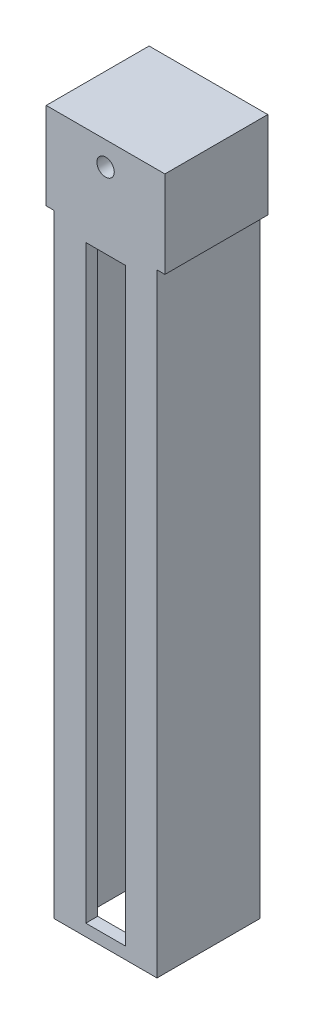
ISO-10303-21;
HEADER;
FILE_DESCRIPTION(('STEP AP214'),'2;1');
FILE_NAME('part.step','',(''),(''),'','','');
FILE_SCHEMA(('AUTOMOTIVE_DESIGN { 1 0 10303 214 1 1 1 1 }'));
ENDSEC;
DATA;
#1=APPLICATION_CONTEXT('core data for automotive mechanical design processes');
#2=APPLICATION_PROTOCOL_DEFINITION('international standard','automotive_design',2000,#1);
#3=PRODUCT_CONTEXT('',#1,'mechanical');
#4=PRODUCT('Part','Part','',(#3));
#5=PRODUCT_RELATED_PRODUCT_CATEGORY('part','',(#4));
#6=PRODUCT_DEFINITION_FORMATION('','',#4);
#7=PRODUCT_DEFINITION_CONTEXT('part definition',#1,'design');
#8=PRODUCT_DEFINITION('design','',#6,#7);
#9=PRODUCT_DEFINITION_SHAPE('','',#8);
#10=(LENGTH_UNIT() NAMED_UNIT(*) SI_UNIT(.MILLI.,.METRE.));
#11=(NAMED_UNIT(*) PLANE_ANGLE_UNIT() SI_UNIT($,.RADIAN.));
#12=(NAMED_UNIT(*) SI_UNIT($,.STERADIAN.) SOLID_ANGLE_UNIT());
#13=UNCERTAINTY_MEASURE_WITH_UNIT(LENGTH_MEASURE(1.E-05),#10,'distance_accuracy_value','');
#14=(GEOMETRIC_REPRESENTATION_CONTEXT(3) GLOBAL_UNCERTAINTY_ASSIGNED_CONTEXT((#13)) GLOBAL_UNIT_ASSIGNED_CONTEXT((#10,
#11,#12)) REPRESENTATION_CONTEXT('',''));
#15=CARTESIAN_POINT('',(0.,0.,0.));
#16=DIRECTION('',(0.,0.,1.));
#17=DIRECTION('',(1.,0.,0.));
#18=AXIS2_PLACEMENT_3D('',#15,#16,#17);
#19=CARTESIAN_POINT('',(0.,0.,0.));
#20=DIRECTION('',(0.,-1.,0.));
#21=DIRECTION('',(0.,0.,-1.));
#22=AXIS2_PLACEMENT_3D('',#19,#20,#21);
#23=PLANE('',#22);
#24=DIRECTION('',(0.,0.,-1.));
#25=VECTOR('',#24,1.);
#26=CARTESIAN_POINT('',(13.,0.,13.));
#27=LINE('',#26,#25);
#28=CARTESIAN_POINT('',(13.,0.,13.));
#29=VERTEX_POINT('',#28);
#30=CARTESIAN_POINT('',(13.,0.,-13.));
#31=VERTEX_POINT('',#30);
#32=EDGE_CURVE('E215',#29,#31,#27,.T.);
#33=ORIENTED_EDGE('',*,*,#32,.F.);
#34=DIRECTION('',(1.,0.,0.));
#35=VECTOR('',#34,1.);
#36=CARTESIAN_POINT('',(-13.,0.,13.));
#37=LINE('',#36,#35);
#38=CARTESIAN_POINT('',(-13.,0.,13.));
#39=VERTEX_POINT('',#38);
#40=EDGE_CURVE('E250',#39,#29,#37,.T.);
#41=ORIENTED_EDGE('',*,*,#40,.F.);
#42=DIRECTION('',(0.,0.,1.));
#43=VECTOR('',#42,1.);
#44=CARTESIAN_POINT('',(-13.,0.,13.));
#45=LINE('',#44,#43);
#46=CARTESIAN_POINT('',(-13.,0.,-13.));
#47=VERTEX_POINT('',#46);
#48=EDGE_CURVE('E258',#47,#39,#45,.T.);
#49=ORIENTED_EDGE('',*,*,#48,.F.);
#50=DIRECTION('',(-1.,0.,0.));
#51=VECTOR('',#50,1.);
#52=CARTESIAN_POINT('',(-13.,0.,-13.));
#53=LINE('',#52,#51);
#54=EDGE_CURVE('E256',#31,#47,#53,.T.);
#55=ORIENTED_EDGE('',*,*,#54,.F.);
#56=EDGE_LOOP('',(#33,#41,#49,#55));
#57=FACE_BOUND('',#56,.T.);
#58=DIRECTION('',(1.,0.,0.));
#59=VECTOR('',#58,1.);
#60=CARTESIAN_POINT('',(0.,0.,10.));
#61=LINE('',#60,#59);
#62=CARTESIAN_POINT('',(-10.,0.,10.));
#63=VERTEX_POINT('',#62);
#64=CARTESIAN_POINT('',(10.,0.,10.));
#65=VERTEX_POINT('',#64);
#66=EDGE_CURVE('E227',#63,#65,#61,.T.);
#67=ORIENTED_EDGE('',*,*,#66,.T.);
#68=DIRECTION('',(0.,0.,-1.));
#69=VECTOR('',#68,1.);
#70=CARTESIAN_POINT('',(10.,0.,0.));
#71=LINE('',#70,#69);
#72=CARTESIAN_POINT('',(10.,0.,-10.));
#73=VERTEX_POINT('',#72);
#74=EDGE_CURVE('E206',#65,#73,#71,.T.);
#75=ORIENTED_EDGE('',*,*,#74,.T.);
#76=DIRECTION('',(-1.,0.,0.));
#77=VECTOR('',#76,1.);
#78=CARTESIAN_POINT('',(0.,0.,-10.));
#79=LINE('',#78,#77);
#80=CARTESIAN_POINT('',(-10.,0.,-10.));
#81=VERTEX_POINT('',#80);
#82=EDGE_CURVE('E226',#73,#81,#79,.T.);
#83=ORIENTED_EDGE('',*,*,#82,.T.);
#84=DIRECTION('',(0.,0.,1.));
#85=VECTOR('',#84,1.);
#86=CARTESIAN_POINT('',(-10.,0.,0.));
#87=LINE('',#86,#85);
#88=EDGE_CURVE('E231',#81,#63,#87,.T.);
#89=ORIENTED_EDGE('',*,*,#88,.T.);
#90=EDGE_LOOP('',(#67,#75,#83,#89));
#91=FACE_BOUND('',#90,.T.);
#92=ADVANCED_FACE('F39',(#57,#91),#23,.T.);
#93=CARTESIAN_POINT('',(13.,155.,13.));
#94=DIRECTION('',(-1.,0.,0.));
#95=DIRECTION('',(0.,0.,1.));
#96=AXIS2_PLACEMENT_3D('',#93,#94,#95);
#97=PLANE('',#96);
#98=ORIENTED_EDGE('',*,*,#32,.T.);
#99=DIRECTION('',(0.,-1.,0.));
#100=VECTOR('',#99,1.);
#101=CARTESIAN_POINT('',(13.,155.,-13.));
#102=LINE('',#101,#100);
#103=CARTESIAN_POINT('',(13.,155.,-13.));
#104=VERTEX_POINT('',#103);
#105=EDGE_CURVE('E11',#104,#31,#102,.T.);
#106=ORIENTED_EDGE('',*,*,#105,.F.);
#107=DIRECTION('',(0.,0.,-1.));
#108=VECTOR('',#107,1.);
#109=CARTESIAN_POINT('',(13.,155.,13.));
#110=LINE('',#109,#108);
#111=CARTESIAN_POINT('',(13.,155.,13.));
#112=VERTEX_POINT('',#111);
#113=EDGE_CURVE('E246',#112,#104,#110,.T.);
#114=ORIENTED_EDGE('',*,*,#113,.F.);
#115=DIRECTION('',(0.,-1.,0.));
#116=VECTOR('',#115,1.);
#117=CARTESIAN_POINT('',(13.,155.,13.));
#118=LINE('',#117,#116);
#119=EDGE_CURVE('E253',#112,#29,#118,.T.);
#120=ORIENTED_EDGE('',*,*,#119,.T.);
#121=EDGE_LOOP('',(#98,#106,#114,#120));
#122=FACE_BOUND('',#121,.T.);
#123=ADVANCED_FACE('F41',(#122),#97,.F.);
#124=CARTESIAN_POINT('',(-13.,155.,-13.));
#125=DIRECTION('',(0.,0.,1.));
#126=DIRECTION('',(1.,0.,0.));
#127=AXIS2_PLACEMENT_3D('',#124,#125,#126);
#128=PLANE('',#127);
#129=CARTESIAN_POINT('',(0.,171.,-13.));
#130=DIRECTION('',(0.,0.,1.));
#131=DIRECTION('',(1.,0.,0.));
#132=AXIS2_PLACEMENT_3D('',#129,#130,#131);
#133=CIRCLE('',#132,2.2);
#134=CARTESIAN_POINT('',(2.2,171.,-13.));
#135=VERTEX_POINT('',#134);
#136=EDGE_CURVE('E299',#135,#135,#133,.T.);
#137=ORIENTED_EDGE('',*,*,#136,.T.);
#138=EDGE_LOOP('',(#137));
#139=FACE_BOUND('',#138,.T.);
#140=ORIENTED_EDGE('',*,*,#54,.T.);
#141=DIRECTION('',(0.,-1.,0.));
#142=VECTOR('',#141,1.);
#143=CARTESIAN_POINT('',(-13.,155.,-13.));
#144=LINE('',#143,#142);
#145=CARTESIAN_POINT('',(-13.,155.,-13.));
#146=VERTEX_POINT('',#145);
#147=EDGE_CURVE('E47',#146,#47,#144,.T.);
#148=ORIENTED_EDGE('',*,*,#147,.F.);
#149=DIRECTION('',(-1.,0.,0.));
#150=VECTOR('',#149,1.);
#151=CARTESIAN_POINT('',(-15.,155.,-13.));
#152=LINE('',#151,#150);
#153=CARTESIAN_POINT('',(-15.,155.,-13.));
#154=VERTEX_POINT('',#153);
#155=EDGE_CURVE('E298',#146,#154,#152,.T.);
#156=ORIENTED_EDGE('',*,*,#155,.T.);
#157=DIRECTION('',(0.,-1.,0.));
#158=VECTOR('',#157,1.);
#159=CARTESIAN_POINT('',(-15.,177.,-13.));
#160=LINE('',#159,#158);
#161=CARTESIAN_POINT('',(-15.,177.,-13.));
#162=VERTEX_POINT('',#161);
#163=EDGE_CURVE('E160',#162,#154,#160,.T.);
#164=ORIENTED_EDGE('',*,*,#163,.F.);
#165=DIRECTION('',(-1.,0.,0.));
#166=VECTOR('',#165,1.);
#167=CARTESIAN_POINT('',(-15.,177.,-13.));
#168=LINE('',#167,#166);
#169=CARTESIAN_POINT('',(15.,177.,-13.));
#170=VERTEX_POINT('',#169);
#171=EDGE_CURVE('E152',#170,#162,#168,.T.);
#172=ORIENTED_EDGE('',*,*,#171,.F.);
#173=DIRECTION('',(0.,-1.,0.));
#174=VECTOR('',#173,1.);
#175=CARTESIAN_POINT('',(15.,177.,-13.));
#176=LINE('',#175,#174);
#177=CARTESIAN_POINT('',(15.,155.,-13.));
#178=VERTEX_POINT('',#177);
#179=EDGE_CURVE('E157',#170,#178,#176,.T.);
#180=ORIENTED_EDGE('',*,*,#179,.T.);
#181=EDGE_CURVE('E286',#178,#104,#152,.T.);
#182=ORIENTED_EDGE('',*,*,#181,.T.);
#183=ORIENTED_EDGE('',*,*,#105,.T.);
#184=EDGE_LOOP('',(#140,#148,#156,#164,#172,#180,#182,#183));
#185=FACE_BOUND('',#184,.T.);
#186=ADVANCED_FACE('F154',(#139,#185),#128,.F.);
#187=CARTESIAN_POINT('',(-13.,155.,13.));
#188=DIRECTION('',(1.,0.,0.));
#189=DIRECTION('',(0.,0.,-1.));
#190=AXIS2_PLACEMENT_3D('',#187,#188,#189);
#191=PLANE('',#190);
#192=ORIENTED_EDGE('',*,*,#48,.T.);
#193=DIRECTION('',(0.,-1.,0.));
#194=VECTOR('',#193,1.);
#195=CARTESIAN_POINT('',(-13.,155.,13.));
#196=LINE('',#195,#194);
#197=CARTESIAN_POINT('',(-13.,155.,13.));
#198=VERTEX_POINT('',#197);
#199=EDGE_CURVE('E263',#198,#39,#196,.T.);
#200=ORIENTED_EDGE('',*,*,#199,.F.);
#201=DIRECTION('',(0.,0.,1.));
#202=VECTOR('',#201,1.);
#203=CARTESIAN_POINT('',(-13.,155.,13.));
#204=LINE('',#203,#202);
#205=EDGE_CURVE('E249',#146,#198,#204,.T.);
#206=ORIENTED_EDGE('',*,*,#205,.F.);
#207=ORIENTED_EDGE('',*,*,#147,.T.);
#208=EDGE_LOOP('',(#192,#200,#206,#207));
#209=FACE_BOUND('',#208,.T.);
#210=ADVANCED_FACE('F269',(#209),#191,.F.);
#211=CARTESIAN_POINT('',(-13.,155.,13.));
#212=DIRECTION('',(0.,0.,-1.));
#213=DIRECTION('',(-1.,0.,0.));
#214=AXIS2_PLACEMENT_3D('',#211,#212,#213);
#215=PLANE('',#214);
#216=CARTESIAN_POINT('',(0.,171.,13.));
#217=DIRECTION('',(0.,0.,1.));
#218=DIRECTION('',(1.,0.,0.));
#219=AXIS2_PLACEMENT_3D('',#216,#217,#218);
#220=CIRCLE('',#219,2.2);
#221=CARTESIAN_POINT('',(2.2,171.,13.));
#222=VERTEX_POINT('',#221);
#223=EDGE_CURVE('E304',#222,#222,#220,.T.);
#224=ORIENTED_EDGE('',*,*,#223,.F.);
#225=EDGE_LOOP('',(#224));
#226=FACE_BOUND('',#225,.T.);
#227=DIRECTION('',(1.,0.,0.));
#228=VECTOR('',#227,1.);
#229=CARTESIAN_POINT('',(5.,3.,13.));
#230=LINE('',#229,#228);
#231=CARTESIAN_POINT('',(-5.,3.,13.));
#232=VERTEX_POINT('',#231);
#233=CARTESIAN_POINT('',(5.,3.,13.));
#234=VERTEX_POINT('',#233);
#235=EDGE_CURVE('E179',#232,#234,#230,.T.);
#236=ORIENTED_EDGE('',*,*,#235,.F.);
#237=DIRECTION('',(0.,-1.,0.));
#238=VECTOR('',#237,1.);
#239=CARTESIAN_POINT('',(-5.,3.,13.));
#240=LINE('',#239,#238);
#241=CARTESIAN_POINT('',(-5.,152.,13.));
#242=VERTEX_POINT('',#241);
#243=EDGE_CURVE('E54',#242,#232,#240,.T.);
#244=ORIENTED_EDGE('',*,*,#243,.F.);
#245=DIRECTION('',(-1.,0.,0.));
#246=VECTOR('',#245,1.);
#247=CARTESIAN_POINT('',(5.,152.,13.));
#248=LINE('',#247,#246);
#249=CARTESIAN_POINT('',(5.,152.,13.));
#250=VERTEX_POINT('',#249);
#251=EDGE_CURVE('E189',#250,#242,#248,.T.);
#252=ORIENTED_EDGE('',*,*,#251,.F.);
#253=DIRECTION('',(0.,1.,0.));
#254=VECTOR('',#253,1.);
#255=CARTESIAN_POINT('',(5.,3.,13.));
#256=LINE('',#255,#254);
#257=EDGE_CURVE('E199',#234,#250,#256,.T.);
#258=ORIENTED_EDGE('',*,*,#257,.F.);
#259=EDGE_LOOP('',(#236,#244,#252,#258));
#260=FACE_BOUND('',#259,.T.);
#261=ORIENTED_EDGE('',*,*,#40,.T.);
#262=ORIENTED_EDGE('',*,*,#119,.F.);
#263=DIRECTION('',(1.,0.,0.));
#264=VECTOR('',#263,1.);
#265=CARTESIAN_POINT('',(-15.,155.,13.));
#266=LINE('',#265,#264);
#267=CARTESIAN_POINT('',(15.,155.,13.));
#268=VERTEX_POINT('',#267);
#269=EDGE_CURVE('E282',#112,#268,#266,.T.);
#270=ORIENTED_EDGE('',*,*,#269,.T.);
#271=DIRECTION('',(0.,-1.,0.));
#272=VECTOR('',#271,1.);
#273=CARTESIAN_POINT('',(15.,177.,13.));
#274=LINE('',#273,#272);
#275=CARTESIAN_POINT('',(15.,177.,13.));
#276=VERTEX_POINT('',#275);
#277=EDGE_CURVE('E290',#276,#268,#274,.T.);
#278=ORIENTED_EDGE('',*,*,#277,.F.);
#279=DIRECTION('',(1.,0.,0.));
#280=VECTOR('',#279,1.);
#281=CARTESIAN_POINT('',(-15.,177.,13.));
#282=LINE('',#281,#280);
#283=CARTESIAN_POINT('',(-15.,177.,13.));
#284=VERTEX_POINT('',#283);
#285=EDGE_CURVE('E169',#284,#276,#282,.T.);
#286=ORIENTED_EDGE('',*,*,#285,.F.);
#287=DIRECTION('',(0.,-1.,0.));
#288=VECTOR('',#287,1.);
#289=CARTESIAN_POINT('',(-15.,177.,13.));
#290=LINE('',#289,#288);
#291=CARTESIAN_POINT('',(-15.,155.,13.));
#292=VERTEX_POINT('',#291);
#293=EDGE_CURVE('E181',#284,#292,#290,.T.);
#294=ORIENTED_EDGE('',*,*,#293,.T.);
#295=EDGE_CURVE('E173',#292,#198,#266,.T.);
#296=ORIENTED_EDGE('',*,*,#295,.T.);
#297=ORIENTED_EDGE('',*,*,#199,.T.);
#298=EDGE_LOOP('',(#261,#262,#270,#278,#286,#294,#296,#297));
#299=FACE_BOUND('',#298,.T.);
#300=ADVANCED_FACE('F276',(#226,#260,#299),#215,.F.);
#301=CARTESIAN_POINT('',(10.,155.,13.));
#302=DIRECTION('',(-1.,0.,0.));
#303=DIRECTION('',(0.,0.,1.));
#304=AXIS2_PLACEMENT_3D('',#301,#302,#303);
#305=PLANE('',#304);
#306=ORIENTED_EDGE('',*,*,#74,.F.);
#307=DIRECTION('',(0.,-1.,0.));
#308=VECTOR('',#307,1.);
#309=CARTESIAN_POINT('',(10.,155.,10.));
#310=LINE('',#309,#308);
#311=CARTESIAN_POINT('',(10.,155.,10.));
#312=VERTEX_POINT('',#311);
#313=EDGE_CURVE('E217',#312,#65,#310,.T.);
#314=ORIENTED_EDGE('',*,*,#313,.F.);
#315=DIRECTION('',(0.,0.,-1.));
#316=VECTOR('',#315,1.);
#317=CARTESIAN_POINT('',(10.,155.,0.));
#318=LINE('',#317,#316);
#319=CARTESIAN_POINT('',(10.,155.,-10.));
#320=VERTEX_POINT('',#319);
#321=EDGE_CURVE('E230',#312,#320,#318,.T.);
#322=ORIENTED_EDGE('',*,*,#321,.T.);
#323=DIRECTION('',(0.,-1.,0.));
#324=VECTOR('',#323,1.);
#325=CARTESIAN_POINT('',(10.,155.,-10.));
#326=LINE('',#325,#324);
#327=EDGE_CURVE('E212',#320,#73,#326,.T.);
#328=ORIENTED_EDGE('',*,*,#327,.T.);
#329=EDGE_LOOP('',(#306,#314,#322,#328));
#330=FACE_BOUND('',#329,.T.);
#331=ADVANCED_FACE('F319',(#330),#305,.T.);
#332=CARTESIAN_POINT('',(-13.,155.,-10.));
#333=DIRECTION('',(0.,0.,1.));
#334=DIRECTION('',(1.,0.,0.));
#335=AXIS2_PLACEMENT_3D('',#332,#333,#334);
#336=PLANE('',#335);
#337=ORIENTED_EDGE('',*,*,#82,.F.);
#338=ORIENTED_EDGE('',*,*,#327,.F.);
#339=DIRECTION('',(-1.,0.,0.));
#340=VECTOR('',#339,1.);
#341=CARTESIAN_POINT('',(0.,155.,-10.));
#342=LINE('',#341,#340);
#343=CARTESIAN_POINT('',(-10.,155.,-10.));
#344=VERTEX_POINT('',#343);
#345=EDGE_CURVE('E238',#320,#344,#342,.T.);
#346=ORIENTED_EDGE('',*,*,#345,.T.);
#347=DIRECTION('',(0.,-1.,0.));
#348=VECTOR('',#347,1.);
#349=CARTESIAN_POINT('',(-10.,155.,-10.));
#350=LINE('',#349,#348);
#351=EDGE_CURVE('E216',#344,#81,#350,.T.);
#352=ORIENTED_EDGE('',*,*,#351,.T.);
#353=EDGE_LOOP('',(#337,#338,#346,#352));
#354=FACE_BOUND('',#353,.T.);
#355=ADVANCED_FACE('F434',(#354),#336,.T.);
#356=CARTESIAN_POINT('',(-10.,155.,13.));
#357=DIRECTION('',(1.,0.,0.));
#358=DIRECTION('',(0.,0.,-1.));
#359=AXIS2_PLACEMENT_3D('',#356,#357,#358);
#360=PLANE('',#359);
#361=ORIENTED_EDGE('',*,*,#88,.F.);
#362=ORIENTED_EDGE('',*,*,#351,.F.);
#363=DIRECTION('',(0.,0.,1.));
#364=VECTOR('',#363,1.);
#365=CARTESIAN_POINT('',(-10.,155.,0.));
#366=LINE('',#365,#364);
#367=CARTESIAN_POINT('',(-10.,155.,10.));
#368=VERTEX_POINT('',#367);
#369=EDGE_CURVE('E241',#344,#368,#366,.T.);
#370=ORIENTED_EDGE('',*,*,#369,.T.);
#371=DIRECTION('',(0.,-1.,0.));
#372=VECTOR('',#371,1.);
#373=CARTESIAN_POINT('',(-10.,155.,10.));
#374=LINE('',#373,#372);
#375=EDGE_CURVE('E219',#368,#63,#374,.T.);
#376=ORIENTED_EDGE('',*,*,#375,.T.);
#377=EDGE_LOOP('',(#361,#362,#370,#376));
#378=FACE_BOUND('',#377,.T.);
#379=ADVANCED_FACE('F426',(#378),#360,.T.);
#380=CARTESIAN_POINT('',(-13.,155.,10.));
#381=DIRECTION('',(0.,0.,-1.));
#382=DIRECTION('',(-1.,0.,0.));
#383=AXIS2_PLACEMENT_3D('',#380,#381,#382);
#384=PLANE('',#383);
#385=DIRECTION('',(0.,-1.,0.));
#386=VECTOR('',#385,1.);
#387=CARTESIAN_POINT('',(-5.,3.,10.));
#388=LINE('',#387,#386);
#389=CARTESIAN_POINT('',(-5.,152.,10.));
#390=VERTEX_POINT('',#389);
#391=CARTESIAN_POINT('',(-5.,3.,10.));
#392=VERTEX_POINT('',#391);
#393=EDGE_CURVE('E185',#390,#392,#388,.T.);
#394=ORIENTED_EDGE('',*,*,#393,.T.);
#395=DIRECTION('',(1.,0.,0.));
#396=VECTOR('',#395,1.);
#397=CARTESIAN_POINT('',(5.,3.,10.));
#398=LINE('',#397,#396);
#399=CARTESIAN_POINT('',(4.99999999999999,3.,10.));
#400=VERTEX_POINT('',#399);
#401=EDGE_CURVE('E188',#392,#400,#398,.T.);
#402=ORIENTED_EDGE('',*,*,#401,.T.);
#403=DIRECTION('',(0.,1.,0.));
#404=VECTOR('',#403,1.);
#405=CARTESIAN_POINT('',(5.,3.,10.));
#406=LINE('',#405,#404);
#407=CARTESIAN_POINT('',(5.,152.,10.));
#408=VERTEX_POINT('',#407);
#409=EDGE_CURVE('E62',#400,#408,#406,.T.);
#410=ORIENTED_EDGE('',*,*,#409,.T.);
#411=DIRECTION('',(-1.,0.,0.));
#412=VECTOR('',#411,1.);
#413=CARTESIAN_POINT('',(5.,152.,10.));
#414=LINE('',#413,#412);
#415=EDGE_CURVE('E193',#408,#390,#414,.T.);
#416=ORIENTED_EDGE('',*,*,#415,.T.);
#417=EDGE_LOOP('',(#394,#402,#410,#416));
#418=FACE_BOUND('',#417,.T.);
#419=ORIENTED_EDGE('',*,*,#66,.F.);
#420=ORIENTED_EDGE('',*,*,#375,.F.);
#421=DIRECTION('',(1.,0.,0.));
#422=VECTOR('',#421,1.);
#423=CARTESIAN_POINT('',(0.,155.,10.));
#424=LINE('',#423,#422);
#425=EDGE_CURVE('E220',#368,#312,#424,.T.);
#426=ORIENTED_EDGE('',*,*,#425,.T.);
#427=ORIENTED_EDGE('',*,*,#313,.T.);
#428=EDGE_LOOP('',(#419,#420,#426,#427));
#429=FACE_BOUND('',#428,.T.);
#430=ADVANCED_FACE('F331',(#418,#429),#384,.T.);
#431=CARTESIAN_POINT('',(-5.,3.,10.));
#432=DIRECTION('',(-1.,0.,0.));
#433=DIRECTION('',(0.,0.,1.));
#434=AXIS2_PLACEMENT_3D('',#431,#432,#433);
#435=PLANE('',#434);
#436=ORIENTED_EDGE('',*,*,#243,.T.);
#437=DIRECTION('',(0.,0.,1.));
#438=VECTOR('',#437,1.);
#439=CARTESIAN_POINT('',(-5.,3.,10.));
#440=LINE('',#439,#438);
#441=EDGE_CURVE('E195',#392,#232,#440,.T.);
#442=ORIENTED_EDGE('',*,*,#441,.F.);
#443=ORIENTED_EDGE('',*,*,#393,.F.);
#444=DIRECTION('',(0.,0.,1.));
#445=VECTOR('',#444,1.);
#446=CARTESIAN_POINT('',(-5.,152.,10.));
#447=LINE('',#446,#445);
#448=EDGE_CURVE('E204',#390,#242,#447,.T.);
#449=ORIENTED_EDGE('',*,*,#448,.T.);
#450=EDGE_LOOP('',(#436,#442,#443,#449));
#451=FACE_BOUND('',#450,.T.);
#452=ADVANCED_FACE('F328',(#451),#435,.F.);
#453=CARTESIAN_POINT('',(5.,152.,10.));
#454=DIRECTION('',(0.,1.,0.));
#455=DIRECTION('',(0.,0.,1.));
#456=AXIS2_PLACEMENT_3D('',#453,#454,#455);
#457=PLANE('',#456);
#458=ORIENTED_EDGE('',*,*,#251,.T.);
#459=ORIENTED_EDGE('',*,*,#448,.F.);
#460=ORIENTED_EDGE('',*,*,#415,.F.);
#461=DIRECTION('',(0.,0.,1.));
#462=VECTOR('',#461,1.);
#463=CARTESIAN_POINT('',(5.,152.,10.));
#464=LINE('',#463,#462);
#465=EDGE_CURVE('E207',#408,#250,#464,.T.);
#466=ORIENTED_EDGE('',*,*,#465,.T.);
#467=EDGE_LOOP('',(#458,#459,#460,#466));
#468=FACE_BOUND('',#467,.T.);
#469=ADVANCED_FACE('F334',(#468),#457,.F.);
#470=CARTESIAN_POINT('',(5.,3.,10.));
#471=DIRECTION('',(1.,0.,0.));
#472=DIRECTION('',(0.,0.,-1.));
#473=AXIS2_PLACEMENT_3D('',#470,#471,#472);
#474=PLANE('',#473);
#475=ORIENTED_EDGE('',*,*,#257,.T.);
#476=ORIENTED_EDGE('',*,*,#465,.F.);
#477=ORIENTED_EDGE('',*,*,#409,.F.);
#478=DIRECTION('',(0.,0.,1.));
#479=VECTOR('',#478,1.);
#480=CARTESIAN_POINT('',(5.,3.,10.));
#481=LINE('',#480,#479);
#482=EDGE_CURVE('E209',#400,#234,#481,.T.);
#483=ORIENTED_EDGE('',*,*,#482,.T.);
#484=EDGE_LOOP('',(#475,#476,#477,#483));
#485=FACE_BOUND('',#484,.T.);
#486=ADVANCED_FACE('F335',(#485),#474,.F.);
#487=CARTESIAN_POINT('',(5.,3.,10.));
#488=DIRECTION('',(0.,-1.,0.));
#489=DIRECTION('',(0.,0.,-1.));
#490=AXIS2_PLACEMENT_3D('',#487,#488,#489);
#491=PLANE('',#490);
#492=ORIENTED_EDGE('',*,*,#235,.T.);
#493=ORIENTED_EDGE('',*,*,#482,.F.);
#494=ORIENTED_EDGE('',*,*,#401,.F.);
#495=ORIENTED_EDGE('',*,*,#441,.T.);
#496=EDGE_LOOP('',(#492,#493,#494,#495));
#497=FACE_BOUND('',#496,.T.);
#498=ADVANCED_FACE('F325',(#497),#491,.F.);
#499=CARTESIAN_POINT('',(0.,155.,0.));
#500=DIRECTION('',(0.,-1.,0.));
#501=DIRECTION('',(0.,0.,-1.));
#502=AXIS2_PLACEMENT_3D('',#499,#500,#501);
#503=PLANE('',#502);
#504=ORIENTED_EDGE('',*,*,#321,.F.);
#505=ORIENTED_EDGE('',*,*,#425,.F.);
#506=ORIENTED_EDGE('',*,*,#369,.F.);
#507=ORIENTED_EDGE('',*,*,#345,.F.);
#508=EDGE_LOOP('',(#504,#505,#506,#507));
#509=FACE_BOUND('',#508,.T.);
#510=ADVANCED_FACE('F342',(#509),#503,.T.);
#511=ORIENTED_EDGE('',*,*,#269,.F.);
#512=ORIENTED_EDGE('',*,*,#113,.T.);
#513=ORIENTED_EDGE('',*,*,#181,.F.);
#514=DIRECTION('',(0.,0.,-1.));
#515=VECTOR('',#514,1.);
#516=CARTESIAN_POINT('',(15.,155.,13.));
#517=LINE('',#516,#515);
#518=EDGE_CURVE('E177',#268,#178,#517,.T.);
#519=ORIENTED_EDGE('',*,*,#518,.F.);
#520=EDGE_LOOP('',(#511,#512,#513,#519));
#521=FACE_BOUND('',#520,.T.);
#522=ADVANCED_FACE('F283',(#521),#503,.T.);
#523=CARTESIAN_POINT('',(15.,177.,13.));
#524=DIRECTION('',(-1.,0.,0.));
#525=DIRECTION('',(0.,0.,1.));
#526=AXIS2_PLACEMENT_3D('',#523,#524,#525);
#527=PLANE('',#526);
#528=ORIENTED_EDGE('',*,*,#518,.T.);
#529=ORIENTED_EDGE('',*,*,#179,.F.);
#530=DIRECTION('',(0.,0.,-1.));
#531=VECTOR('',#530,1.);
#532=CARTESIAN_POINT('',(15.,177.,13.));
#533=LINE('',#532,#531);
#534=EDGE_CURVE('E164',#276,#170,#533,.T.);
#535=ORIENTED_EDGE('',*,*,#534,.F.);
#536=ORIENTED_EDGE('',*,*,#277,.T.);
#537=EDGE_LOOP('',(#528,#529,#535,#536));
#538=FACE_BOUND('',#537,.T.);
#539=ADVANCED_FACE('F175',(#538),#527,.F.);
#540=CARTESIAN_POINT('',(-15.,177.,13.));
#541=DIRECTION('',(1.,0.,0.));
#542=DIRECTION('',(0.,0.,-1.));
#543=AXIS2_PLACEMENT_3D('',#540,#541,#542);
#544=PLANE('',#543);
#545=DIRECTION('',(0.,0.,1.));
#546=VECTOR('',#545,1.);
#547=CARTESIAN_POINT('',(-15.,155.,13.));
#548=LINE('',#547,#546);
#549=EDGE_CURVE('E284',#154,#292,#548,.T.);
#550=ORIENTED_EDGE('',*,*,#549,.T.);
#551=ORIENTED_EDGE('',*,*,#293,.F.);
#552=DIRECTION('',(0.,0.,1.));
#553=VECTOR('',#552,1.);
#554=CARTESIAN_POINT('',(-15.,177.,13.));
#555=LINE('',#554,#553);
#556=EDGE_CURVE('E163',#162,#284,#555,.T.);
#557=ORIENTED_EDGE('',*,*,#556,.F.);
#558=ORIENTED_EDGE('',*,*,#163,.T.);
#559=EDGE_LOOP('',(#550,#551,#557,#558));
#560=FACE_BOUND('',#559,.T.);
#561=ADVANCED_FACE('F388',(#560),#544,.F.);
#562=CARTESIAN_POINT('',(0.,177.,0.));
#563=DIRECTION('',(0.,-1.,0.));
#564=DIRECTION('',(0.,0.,-1.));
#565=AXIS2_PLACEMENT_3D('',#562,#563,#564);
#566=PLANE('',#565);
#567=ORIENTED_EDGE('',*,*,#534,.T.);
#568=ORIENTED_EDGE('',*,*,#171,.T.);
#569=ORIENTED_EDGE('',*,*,#556,.T.);
#570=ORIENTED_EDGE('',*,*,#285,.T.);
#571=EDGE_LOOP('',(#567,#568,#569,#570));
#572=FACE_BOUND('',#571,.T.);
#573=ADVANCED_FACE('F167',(#572),#566,.F.);
#574=ORIENTED_EDGE('',*,*,#155,.F.);
#575=ORIENTED_EDGE('',*,*,#205,.T.);
#576=ORIENTED_EDGE('',*,*,#295,.F.);
#577=ORIENTED_EDGE('',*,*,#549,.F.);
#578=EDGE_LOOP('',(#574,#575,#576,#577));
#579=FACE_BOUND('',#578,.T.);
#580=ADVANCED_FACE('F297',(#579),#503,.T.);
#581=CARTESIAN_POINT('',(0.,171.,-13.));
#582=DIRECTION('',(0.,0.,1.));
#583=DIRECTION('',(1.,0.,0.));
#584=AXIS2_PLACEMENT_3D('',#581,#582,#583);
#585=CYLINDRICAL_SURFACE('',#584,2.2);
#586=CARTESIAN_POINT('',(2.2,171.,-13.));
#587=CARTESIAN_POINT('',(2.2,171.,-12.7291666666667));
#588=CARTESIAN_POINT('',(2.2,171.,-12.4583333333333));
#589=CARTESIAN_POINT('',(2.2,171.,-11.9166666666667));
#590=CARTESIAN_POINT('',(2.2,171.,-11.6458333333333));
#591=CARTESIAN_POINT('',(2.2,171.,-11.1041666666667));
#592=CARTESIAN_POINT('',(2.2,171.,-10.8333333333333));
#593=CARTESIAN_POINT('',(2.2,171.,-10.2916666666667));
#594=CARTESIAN_POINT('',(2.2,171.,-10.0208333333333));
#595=CARTESIAN_POINT('',(2.2,171.,-9.47916666666667));
#596=CARTESIAN_POINT('',(2.2,171.,-9.20833333333333));
#597=CARTESIAN_POINT('',(2.2,171.,-8.66666666666667));
#598=CARTESIAN_POINT('',(2.2,171.,-8.39583333333333));
#599=CARTESIAN_POINT('',(2.2,171.,-7.85416666666667));
#600=CARTESIAN_POINT('',(2.2,171.,-7.58333333333333));
#601=CARTESIAN_POINT('',(2.2,171.,-7.04166666666667));
#602=CARTESIAN_POINT('',(2.2,171.,-6.77083333333333));
#603=CARTESIAN_POINT('',(2.2,171.,-6.22916666666667));
#604=CARTESIAN_POINT('',(2.2,171.,-5.95833333333333));
#605=CARTESIAN_POINT('',(2.2,171.,-5.41666666666667));
#606=CARTESIAN_POINT('',(2.2,171.,-5.14583333333333));
#607=CARTESIAN_POINT('',(2.2,171.,-4.60416666666667));
#608=CARTESIAN_POINT('',(2.2,171.,-4.33333333333333));
#609=CARTESIAN_POINT('',(2.2,171.,-3.79166666666667));
#610=CARTESIAN_POINT('',(2.2,171.,-3.52083333333333));
#611=CARTESIAN_POINT('',(2.2,171.,-2.97916666666667));
#612=CARTESIAN_POINT('',(2.2,171.,-2.70833333333333));
#613=CARTESIAN_POINT('',(2.2,171.,-2.16666666666667));
#614=CARTESIAN_POINT('',(2.2,171.,-1.89583333333333));
#615=CARTESIAN_POINT('',(2.2,171.,-1.35416666666667));
#616=CARTESIAN_POINT('',(2.2,171.,-1.08333333333333));
#617=CARTESIAN_POINT('',(2.2,171.,-0.541666666666667));
#618=CARTESIAN_POINT('',(2.2,171.,-0.270833333333333));
#619=CARTESIAN_POINT('',(2.2,171.,0.270833333333333));
#620=CARTESIAN_POINT('',(2.2,171.,0.541666666666667));
#621=CARTESIAN_POINT('',(2.2,171.,1.08333333333333));
#622=CARTESIAN_POINT('',(2.2,171.,1.35416666666667));
#623=CARTESIAN_POINT('',(2.2,171.,1.89583333333333));
#624=CARTESIAN_POINT('',(2.2,171.,2.16666666666667));
#625=CARTESIAN_POINT('',(2.2,171.,2.70833333333333));
#626=CARTESIAN_POINT('',(2.2,171.,2.97916666666667));
#627=CARTESIAN_POINT('',(2.2,171.,3.52083333333333));
#628=CARTESIAN_POINT('',(2.2,171.,3.79166666666667));
#629=CARTESIAN_POINT('',(2.2,171.,4.33333333333333));
#630=CARTESIAN_POINT('',(2.2,171.,4.60416666666667));
#631=CARTESIAN_POINT('',(2.2,171.,5.14583333333333));
#632=CARTESIAN_POINT('',(2.2,171.,5.41666666666667));
#633=CARTESIAN_POINT('',(2.2,171.,5.95833333333333));
#634=CARTESIAN_POINT('',(2.2,171.,6.22916666666667));
#635=CARTESIAN_POINT('',(2.2,171.,6.77083333333333));
#636=CARTESIAN_POINT('',(2.2,171.,7.04166666666667));
#637=CARTESIAN_POINT('',(2.2,171.,7.58333333333333));
#638=CARTESIAN_POINT('',(2.2,171.,7.85416666666667));
#639=CARTESIAN_POINT('',(2.2,171.,8.39583333333333));
#640=CARTESIAN_POINT('',(2.2,171.,8.66666666666667));
#641=CARTESIAN_POINT('',(2.2,171.,9.20833333333333));
#642=CARTESIAN_POINT('',(2.2,171.,9.47916666666667));
#643=CARTESIAN_POINT('',(2.2,171.,10.0208333333333));
#644=CARTESIAN_POINT('',(2.2,171.,10.2916666666667));
#645=CARTESIAN_POINT('',(2.2,171.,10.8333333333333));
#646=CARTESIAN_POINT('',(2.2,171.,11.1041666666667));
#647=CARTESIAN_POINT('',(2.2,171.,11.6458333333333));
#648=CARTESIAN_POINT('',(2.2,171.,11.9166666666667));
#649=CARTESIAN_POINT('',(2.2,171.,12.4583333333333));
#650=CARTESIAN_POINT('',(2.2,171.,12.7291666666667));
#651=CARTESIAN_POINT('',(2.2,171.,13.));
#652=B_SPLINE_CURVE_WITH_KNOTS('',3,(#586,#587,#588,#589,#590,#591,#592,#593,#594,#595,#596,
#597,#598,#599,#600,#601,#602,#603,#604,#605,#606,#607,#608,#609,#610,#611,#612,#613,#614,#615,
#616,#617,#618,#619,#620,#621,#622,#623,#624,#625,#626,#627,#628,#629,#630,#631,#632,#633,#634,
#635,#636,#637,#638,#639,#640,#641,#642,#643,#644,#645,#646,#647,#648,#649,#650,#651),
.UNSPECIFIED.,.F.,.F.,(4,2,2,2,2,2,2,2,2,2,2,2,2,2,2,2,2,2,2,2,2,2,2,2,2,2,2,2,2,2,2,2,4),(0.,
0.812499999999999,1.625,2.4375,3.25,4.0625,4.875,5.6875,6.5,7.3125,8.125,8.9375,9.75,10.5625,
11.375,12.1875,13.,13.8125,14.625,15.4375,16.25,17.0625,17.875,18.6875,19.5,20.3125,21.125,
21.9375,22.75,23.5625,24.375,25.1875,26.),.UNSPECIFIED.);
#653=EDGE_CURVE('BSEAM311',#135,#222,#652,.T.);
#654=ORIENTED_EDGE('',*,*,#136,.F.);
#655=ORIENTED_EDGE('',*,*,#223,.T.);
#656=ORIENTED_EDGE('',*,*,#653,.T.);
#657=ORIENTED_EDGE('',*,*,#653,.F.);
#658=EDGE_LOOP('',(#654,#656,#655,#657));
#659=FACE_BOUND('',#658,.T.);
#660=ADVANCED_FACE('F311',(#659),#585,.F.);
#661=CLOSED_SHELL('',(#92,#123,#186,#210,#300,#331,#355,#379,#430,#452,#469,#486,#498,#510,#522,
#539,#561,#573,#580,#660));
#662=MANIFOLD_SOLID_BREP('B2',#661);
#663=ADVANCED_BREP_SHAPE_REPRESENTATION('',(#18,#662),#14);
#664=SHAPE_DEFINITION_REPRESENTATION(#9,#663);
ENDSEC;
END-ISO-10303-21;
